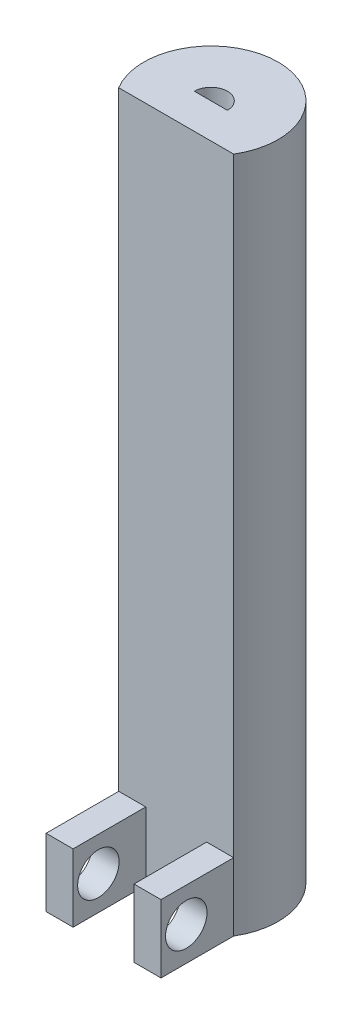
ISO-10303-21;
HEADER;
FILE_DESCRIPTION(('STEP AP214'),'2;1');
FILE_NAME('part.step','',(''),(''),'','','');
FILE_SCHEMA(('AUTOMOTIVE_DESIGN { 1 0 10303 214 1 1 1 1 }'));
ENDSEC;
DATA;
#1=APPLICATION_CONTEXT('core data for automotive mechanical design processes');
#2=APPLICATION_PROTOCOL_DEFINITION('international standard','automotive_design',2000,#1);
#3=PRODUCT_CONTEXT('',#1,'mechanical');
#4=PRODUCT('Part','Part','',(#3));
#5=PRODUCT_RELATED_PRODUCT_CATEGORY('part','',(#4));
#6=PRODUCT_DEFINITION_FORMATION('','',#4);
#7=PRODUCT_DEFINITION_CONTEXT('part definition',#1,'design');
#8=PRODUCT_DEFINITION('design','',#6,#7);
#9=PRODUCT_DEFINITION_SHAPE('','',#8);
#10=(LENGTH_UNIT() NAMED_UNIT(*) SI_UNIT(.MILLI.,.METRE.));
#11=(NAMED_UNIT(*) PLANE_ANGLE_UNIT() SI_UNIT($,.RADIAN.));
#12=(NAMED_UNIT(*) SI_UNIT($,.STERADIAN.) SOLID_ANGLE_UNIT());
#13=UNCERTAINTY_MEASURE_WITH_UNIT(LENGTH_MEASURE(1.E-05),#10,'distance_accuracy_value','');
#14=(GEOMETRIC_REPRESENTATION_CONTEXT(3) GLOBAL_UNCERTAINTY_ASSIGNED_CONTEXT((#13)) GLOBAL_UNIT_ASSIGNED_CONTEXT((#10,
#11,#12)) REPRESENTATION_CONTEXT('',''));
#15=CARTESIAN_POINT('',(0.,0.,0.));
#16=DIRECTION('',(0.,0.,1.));
#17=DIRECTION('',(1.,0.,0.));
#18=AXIS2_PLACEMENT_3D('',#15,#16,#17);
#19=CARTESIAN_POINT('',(10.8004451861737,28.448,6.53795652974117));
#20=DIRECTION('',(0.,0.,-1.));
#21=DIRECTION('',(-1.,0.,0.));
#22=AXIS2_PLACEMENT_3D('',#19,#20,#21);
#23=PLANE('',#22);
#24=DIRECTION('',(0.,-1.,0.));
#25=VECTOR('',#24,1.);
#26=CARTESIAN_POINT('',(5.72044518617372,-114.498809878987,6.53795652974117));
#27=LINE('',#26,#25);
#28=CARTESIAN_POINT('',(5.72044518617372,-114.498809878987,6.53795652974117));
#29=VERTEX_POINT('',#28);
#30=CARTESIAN_POINT('',(5.72044518617372,-127.254,6.53795652974117));
#31=VERTEX_POINT('',#30);
#32=EDGE_CURVE('E48',#29,#31,#27,.T.);
#33=ORIENTED_EDGE('',*,*,#32,.F.);
#34=DIRECTION('',(-1.,0.,0.));
#35=VECTOR('',#34,1.);
#36=CARTESIAN_POINT('',(10.8004451861737,-114.498809878987,6.53795652974117));
#37=LINE('',#36,#35);
#38=CARTESIAN_POINT('',(10.8004451861737,-114.498809878987,6.53795652974117));
#39=VERTEX_POINT('',#38);
#40=EDGE_CURVE('E52',#39,#29,#37,.T.);
#41=ORIENTED_EDGE('',*,*,#40,.F.);
#42=DIRECTION('',(0.,-1.,0.));
#43=VECTOR('',#42,1.);
#44=CARTESIAN_POINT('',(10.8004451861737,28.448,6.53795652974117));
#45=LINE('',#44,#43);
#46=CARTESIAN_POINT('',(10.8004451861737,0.,6.53795652974117));
#47=VERTEX_POINT('',#46);
#48=EDGE_CURVE('E204',#47,#39,#45,.T.);
#49=ORIENTED_EDGE('',*,*,#48,.F.);
#50=DIRECTION('',(-1.,0.,0.));
#51=VECTOR('',#50,1.);
#52=CARTESIAN_POINT('',(0.,0.,6.53795652974117));
#53=LINE('',#52,#51);
#54=CARTESIAN_POINT('',(-10.8004451861737,0.,6.53795652974117));
#55=VERTEX_POINT('',#54);
#56=EDGE_CURVE('E211',#47,#55,#53,.T.);
#57=ORIENTED_EDGE('',*,*,#56,.T.);
#58=DIRECTION('',(0.,-1.,0.));
#59=VECTOR('',#58,1.);
#60=CARTESIAN_POINT('',(-10.8004451861737,28.448,6.53795652974117));
#61=LINE('',#60,#59);
#62=CARTESIAN_POINT('',(-10.8004451861737,-114.498809878987,6.53795652974117));
#63=VERTEX_POINT('',#62);
#64=EDGE_CURVE('E203',#55,#63,#61,.T.);
#65=ORIENTED_EDGE('',*,*,#64,.T.);
#66=DIRECTION('',(1.,0.,0.));
#67=VECTOR('',#66,1.);
#68=CARTESIAN_POINT('',(-10.8004451861737,-114.498809878987,6.53795652974117));
#69=LINE('',#68,#67);
#70=CARTESIAN_POINT('',(-5.72044518617372,-114.498809878987,6.53795652974117));
#71=VERTEX_POINT('',#70);
#72=EDGE_CURVE('E169',#63,#71,#69,.T.);
#73=ORIENTED_EDGE('',*,*,#72,.T.);
#74=DIRECTION('',(0.,-1.,0.));
#75=VECTOR('',#74,1.);
#76=CARTESIAN_POINT('',(-5.72044518617372,-114.498809878987,6.53795652974117));
#77=LINE('',#76,#75);
#78=CARTESIAN_POINT('',(-5.72044518617372,-127.254,6.53795652974117));
#79=VERTEX_POINT('',#78);
#80=EDGE_CURVE('E185',#71,#79,#77,.T.);
#81=ORIENTED_EDGE('',*,*,#80,.T.);
#82=DIRECTION('',(1.,0.,0.));
#83=VECTOR('',#82,1.);
#84=CARTESIAN_POINT('',(10.8004451861737,-127.254,6.53795652974117));
#85=LINE('',#84,#83);
#86=EDGE_CURVE('E199',#79,#31,#85,.T.);
#87=ORIENTED_EDGE('',*,*,#86,.T.);
#88=EDGE_LOOP('',(#33,#41,#49,#57,#65,#73,#81,#87));
#89=FACE_BOUND('',#88,.T.);
#90=ADVANCED_FACE('F33',(#89),#23,.F.);
#91=CARTESIAN_POINT('',(0.,-127.254,0.));
#92=DIRECTION('',(0.,1.,0.));
#93=DIRECTION('',(0.,0.,1.));
#94=AXIS2_PLACEMENT_3D('',#91,#92,#93);
#95=CYLINDRICAL_SURFACE('',#94,12.6251531398367);
#96=ORIENTED_EDGE('',*,*,#48,.T.);
#97=DIRECTION('',(0.,-1.,0.));
#98=VECTOR('',#97,1.);
#99=CARTESIAN_POINT('',(10.8004451861737,-114.498809878987,6.53795652974117));
#100=LINE('',#99,#98);
#101=CARTESIAN_POINT('',(10.8004451861737,-127.254,6.53795652974117));
#102=VERTEX_POINT('',#101);
#103=EDGE_CURVE('E152',#39,#102,#100,.T.);
#104=ORIENTED_EDGE('',*,*,#103,.T.);
#105=CARTESIAN_POINT('',(0.,-127.254,0.));
#106=DIRECTION('',(0.,1.,0.));
#107=DIRECTION('',(0.,0.,1.));
#108=AXIS2_PLACEMENT_3D('',#105,#106,#107);
#109=CIRCLE('',#108,12.6251531398367);
#110=CARTESIAN_POINT('',(-10.8004451861737,-127.254,6.53795652974117));
#111=VERTEX_POINT('',#110);
#112=EDGE_CURVE('E209',#102,#111,#109,.T.);
#113=ORIENTED_EDGE('',*,*,#112,.T.);
#114=DIRECTION('',(0.,-1.,0.));
#115=VECTOR('',#114,1.);
#116=CARTESIAN_POINT('',(-10.8004451861737,-114.498809878987,6.53795652974117));
#117=LINE('',#116,#115);
#118=EDGE_CURVE('E188',#63,#111,#117,.T.);
#119=ORIENTED_EDGE('',*,*,#118,.F.);
#120=ORIENTED_EDGE('',*,*,#64,.F.);
#121=CARTESIAN_POINT('',(0.,0.,0.));
#122=DIRECTION('',(0.,1.,0.));
#123=DIRECTION('',(0.,0.,1.));
#124=AXIS2_PLACEMENT_3D('',#121,#122,#123);
#125=CIRCLE('',#124,12.6251531398367);
#126=EDGE_CURVE('E206',#47,#55,#125,.T.);
#127=ORIENTED_EDGE('',*,*,#126,.F.);
#128=EDGE_LOOP('',(#96,#104,#113,#119,#120,#127));
#129=FACE_BOUND('',#128,.T.);
#130=ADVANCED_FACE('F35',(#129),#95,.T.);
#131=CARTESIAN_POINT('',(0.,-127.254,0.));
#132=DIRECTION('',(0.,1.,0.));
#133=DIRECTION('',(0.,0.,1.));
#134=AXIS2_PLACEMENT_3D('',#131,#132,#133);
#135=PLANE('',#134);
#136=DIRECTION('',(-1.,0.,0.));
#137=VECTOR('',#136,1.);
#138=CARTESIAN_POINT('',(-3.12616908784099,-127.254,0.));
#139=LINE('',#138,#137);
#140=CARTESIAN_POINT('',(3.09162578300214,-127.254,0.));
#141=VERTEX_POINT('',#140);
#142=CARTESIAN_POINT('',(-3.12616908784099,-127.254,0.));
#143=VERTEX_POINT('',#142);
#144=EDGE_CURVE('E193',#141,#143,#139,.T.);
#145=ORIENTED_EDGE('',*,*,#144,.F.);
#146=CARTESIAN_POINT('',(-0.0172716524194207,-127.254,0.));
#147=DIRECTION('',(0.,-1.,0.));
#148=DIRECTION('',(0.,0.,1.));
#149=AXIS2_PLACEMENT_3D('',#146,#147,#148);
#150=CIRCLE('',#149,3.10889743542157);
#151=EDGE_CURVE('E184',#143,#141,#150,.T.);
#152=ORIENTED_EDGE('',*,*,#151,.F.);
#153=EDGE_LOOP('',(#145,#152));
#154=FACE_BOUND('',#153,.T.);
#155=ORIENTED_EDGE('',*,*,#112,.F.);
#156=DIRECTION('',(0.,0.,-1.));
#157=VECTOR('',#156,1.);
#158=CARTESIAN_POINT('',(10.8004451861737,-127.254,20.1914354390968));
#159=LINE('',#158,#157);
#160=CARTESIAN_POINT('',(10.8004451861737,-127.254,20.1914354390968));
#161=VERTEX_POINT('',#160);
#162=EDGE_CURVE('E136',#161,#102,#159,.T.);
#163=ORIENTED_EDGE('',*,*,#162,.F.);
#164=DIRECTION('',(1.,0.,0.));
#165=VECTOR('',#164,1.);
#166=CARTESIAN_POINT('',(5.72044518617372,-127.254,20.1914354390968));
#167=LINE('',#166,#165);
#168=CARTESIAN_POINT('',(5.72044518617372,-127.254,20.1914354390968));
#169=VERTEX_POINT('',#168);
#170=EDGE_CURVE('E146',#169,#161,#167,.T.);
#171=ORIENTED_EDGE('',*,*,#170,.F.);
#172=DIRECTION('',(0.,0.,1.));
#173=VECTOR('',#172,1.);
#174=CARTESIAN_POINT('',(5.72044518617372,-127.254,6.53795652974117));
#175=LINE('',#174,#173);
#176=EDGE_CURVE('E127',#31,#169,#175,.T.);
#177=ORIENTED_EDGE('',*,*,#176,.F.);
#178=ORIENTED_EDGE('',*,*,#86,.F.);
#179=DIRECTION('',(0.,0.,1.));
#180=VECTOR('',#179,1.);
#181=CARTESIAN_POINT('',(-5.72044518617372,-127.254,6.53795652974117));
#182=LINE('',#181,#180);
#183=CARTESIAN_POINT('',(-5.72044518617372,-127.254,20.1914354390968));
#184=VERTEX_POINT('',#183);
#185=EDGE_CURVE('E166',#79,#184,#182,.T.);
#186=ORIENTED_EDGE('',*,*,#185,.T.);
#187=DIRECTION('',(-1.,0.,0.));
#188=VECTOR('',#187,1.);
#189=CARTESIAN_POINT('',(-5.72044518617372,-127.254,20.1914354390968));
#190=LINE('',#189,#188);
#191=CARTESIAN_POINT('',(-10.8004451861737,-127.254,20.1914354390968));
#192=VERTEX_POINT('',#191);
#193=EDGE_CURVE('E159',#184,#192,#190,.T.);
#194=ORIENTED_EDGE('',*,*,#193,.T.);
#195=DIRECTION('',(0.,0.,-1.));
#196=VECTOR('',#195,1.);
#197=CARTESIAN_POINT('',(-10.8004451861737,-127.254,20.1914354390968));
#198=LINE('',#197,#196);
#199=EDGE_CURVE('E177',#192,#111,#198,.T.);
#200=ORIENTED_EDGE('',*,*,#199,.T.);
#201=EDGE_LOOP('',(#155,#163,#171,#177,#178,#186,#194,#200));
#202=FACE_BOUND('',#201,.T.);
#203=ADVANCED_FACE('F227',(#154,#202),#135,.F.);
#204=CARTESIAN_POINT('',(0.,0.,0.));
#205=DIRECTION('',(0.,1.,0.));
#206=DIRECTION('',(0.,0.,1.));
#207=AXIS2_PLACEMENT_3D('',#204,#205,#206);
#208=PLANE('',#207);
#209=CARTESIAN_POINT('',(-0.0172716524194207,0.,0.));
#210=DIRECTION('',(0.,1.,0.));
#211=DIRECTION('',(0.,0.,1.));
#212=AXIS2_PLACEMENT_3D('',#209,#210,#211);
#213=CIRCLE('',#212,3.10889743542157);
#214=CARTESIAN_POINT('',(3.09162578300214,0.,0.));
#215=VERTEX_POINT('',#214);
#216=CARTESIAN_POINT('',(-3.12616908784099,0.,0.));
#217=VERTEX_POINT('',#216);
#218=EDGE_CURVE('E11',#215,#217,#213,.T.);
#219=ORIENTED_EDGE('',*,*,#218,.F.);
#220=DIRECTION('',(1.,0.,0.));
#221=VECTOR('',#220,1.);
#222=CARTESIAN_POINT('',(0.,0.,0.));
#223=LINE('',#222,#221);
#224=EDGE_CURVE('E41',#217,#215,#223,.T.);
#225=ORIENTED_EDGE('',*,*,#224,.F.);
#226=EDGE_LOOP('',(#219,#225));
#227=FACE_BOUND('',#226,.T.);
#228=ORIENTED_EDGE('',*,*,#56,.F.);
#229=ORIENTED_EDGE('',*,*,#126,.T.);
#230=EDGE_LOOP('',(#228,#229));
#231=FACE_BOUND('',#230,.T.);
#232=ADVANCED_FACE('F224',(#227,#231),#208,.T.);
#233=CARTESIAN_POINT('',(-0.0172716524194207,13.827655766843,0.));
#234=DIRECTION('',(0.,-1.,0.));
#235=DIRECTION('',(0.,0.,-1.));
#236=AXIS2_PLACEMENT_3D('',#233,#234,#235);
#237=CYLINDRICAL_SURFACE('',#236,3.10889743542157);
#238=ORIENTED_EDGE('',*,*,#218,.T.);
#239=DIRECTION('',(0.,-1.,0.));
#240=VECTOR('',#239,1.);
#241=CARTESIAN_POINT('',(-3.12616908784099,13.827655766843,0.));
#242=LINE('',#241,#240);
#243=EDGE_CURVE('E197',#217,#143,#242,.T.);
#244=ORIENTED_EDGE('',*,*,#243,.T.);
#245=ORIENTED_EDGE('',*,*,#151,.T.);
#246=DIRECTION('',(0.,-1.,0.));
#247=VECTOR('',#246,1.);
#248=CARTESIAN_POINT('',(3.09162578300214,13.827655766843,0.));
#249=LINE('',#248,#247);
#250=EDGE_CURVE('E196',#215,#141,#249,.T.);
#251=ORIENTED_EDGE('',*,*,#250,.F.);
#252=EDGE_LOOP('',(#238,#244,#245,#251));
#253=FACE_BOUND('',#252,.T.);
#254=ADVANCED_FACE('F222',(#253),#237,.F.);
#255=CARTESIAN_POINT('',(-3.12616908784099,13.827655766843,0.));
#256=DIRECTION('',(0.,0.,1.));
#257=DIRECTION('',(1.,0.,0.));
#258=AXIS2_PLACEMENT_3D('',#255,#256,#257);
#259=PLANE('',#258);
#260=ORIENTED_EDGE('',*,*,#224,.T.);
#261=ORIENTED_EDGE('',*,*,#250,.T.);
#262=ORIENTED_EDGE('',*,*,#144,.T.);
#263=ORIENTED_EDGE('',*,*,#243,.F.);
#264=EDGE_LOOP('',(#260,#261,#262,#263));
#265=FACE_BOUND('',#264,.T.);
#266=ADVANCED_FACE('F217',(#265),#259,.F.);
#267=CARTESIAN_POINT('',(-5.72044518617372,-114.498809878987,20.1914354390968));
#268=DIRECTION('',(0.,0.,1.));
#269=DIRECTION('',(1.,0.,0.));
#270=AXIS2_PLACEMENT_3D('',#267,#268,#269);
#271=PLANE('',#270);
#272=ORIENTED_EDGE('',*,*,#193,.F.);
#273=DIRECTION('',(0.,-1.,0.));
#274=VECTOR('',#273,1.);
#275=CARTESIAN_POINT('',(-5.72044518617372,-114.498809878987,20.1914354390968));
#276=LINE('',#275,#274);
#277=CARTESIAN_POINT('',(-5.72044518617372,-114.498809878987,20.1914354390968));
#278=VERTEX_POINT('',#277);
#279=EDGE_CURVE('E182',#278,#184,#276,.T.);
#280=ORIENTED_EDGE('',*,*,#279,.F.);
#281=DIRECTION('',(-1.,0.,0.));
#282=VECTOR('',#281,1.);
#283=CARTESIAN_POINT('',(-5.72044518617372,-114.498809878987,20.1914354390968));
#284=LINE('',#283,#282);
#285=CARTESIAN_POINT('',(-10.8004451861737,-114.498809878987,20.1914354390968));
#286=VERTEX_POINT('',#285);
#287=EDGE_CURVE('E162',#278,#286,#284,.T.);
#288=ORIENTED_EDGE('',*,*,#287,.T.);
#289=DIRECTION('',(0.,-1.,0.));
#290=VECTOR('',#289,1.);
#291=CARTESIAN_POINT('',(-10.8004451861737,-114.498809878987,20.1914354390968));
#292=LINE('',#291,#290);
#293=EDGE_CURVE('E174',#286,#192,#292,.T.);
#294=ORIENTED_EDGE('',*,*,#293,.T.);
#295=EDGE_LOOP('',(#272,#280,#288,#294));
#296=FACE_BOUND('',#295,.T.);
#297=ADVANCED_FACE('F244',(#296),#271,.T.);
#298=CARTESIAN_POINT('',(-5.72044518617372,-114.498809878987,6.53795652974117));
#299=DIRECTION('',(1.,0.,0.));
#300=DIRECTION('',(0.,0.,-1.));
#301=AXIS2_PLACEMENT_3D('',#298,#299,#300);
#302=PLANE('',#301);
#303=CARTESIAN_POINT('',(-5.72044518617372,-120.904,15.4405772856606));
#304=DIRECTION('',(1.,0.,0.));
#305=DIRECTION('',(0.,0.,-1.));
#306=AXIS2_PLACEMENT_3D('',#303,#304,#305);
#307=CIRCLE('',#306,3.89551607477557);
#308=CARTESIAN_POINT('',(-5.72044518617372,-120.904,11.545061210885));
#309=VERTEX_POINT('',#308);
#310=EDGE_CURVE('E151',#309,#309,#307,.F.);
#311=ORIENTED_EDGE('',*,*,#310,.T.);
#312=EDGE_LOOP('',(#311));
#313=FACE_BOUND('',#312,.T.);
#314=ORIENTED_EDGE('',*,*,#185,.F.);
#315=ORIENTED_EDGE('',*,*,#80,.F.);
#316=DIRECTION('',(0.,0.,1.));
#317=VECTOR('',#316,1.);
#318=CARTESIAN_POINT('',(-5.72044518617372,-114.498809878987,6.53795652974117));
#319=LINE('',#318,#317);
#320=EDGE_CURVE('E171',#71,#278,#319,.T.);
#321=ORIENTED_EDGE('',*,*,#320,.T.);
#322=ORIENTED_EDGE('',*,*,#279,.T.);
#323=EDGE_LOOP('',(#314,#315,#321,#322));
#324=FACE_BOUND('',#323,.T.);
#325=ADVANCED_FACE('F247',(#313,#324),#302,.T.);
#326=CARTESIAN_POINT('',(-10.8004451861737,-114.498809878987,20.1914354390968));
#327=DIRECTION('',(-1.,0.,0.));
#328=DIRECTION('',(0.,0.,1.));
#329=AXIS2_PLACEMENT_3D('',#326,#327,#328);
#330=PLANE('',#329);
#331=CARTESIAN_POINT('',(-10.8004451861737,-120.904,15.4405772856606));
#332=DIRECTION('',(-1.,0.,0.));
#333=DIRECTION('',(0.,0.,1.));
#334=AXIS2_PLACEMENT_3D('',#331,#332,#333);
#335=CIRCLE('',#334,3.89551607477557);
#336=CARTESIAN_POINT('',(-10.8004451861737,-120.904,19.3360933604362));
#337=VERTEX_POINT('',#336);
#338=EDGE_CURVE('E156',#337,#337,#335,.T.);
#339=ORIENTED_EDGE('',*,*,#338,.F.);
#340=EDGE_LOOP('',(#339));
#341=FACE_BOUND('',#340,.T.);
#342=ORIENTED_EDGE('',*,*,#199,.F.);
#343=ORIENTED_EDGE('',*,*,#293,.F.);
#344=DIRECTION('',(0.,0.,-1.));
#345=VECTOR('',#344,1.);
#346=CARTESIAN_POINT('',(-10.8004451861737,-114.498809878987,20.1914354390968));
#347=LINE('',#346,#345);
#348=EDGE_CURVE('E165',#286,#63,#347,.T.);
#349=ORIENTED_EDGE('',*,*,#348,.T.);
#350=ORIENTED_EDGE('',*,*,#118,.T.);
#351=EDGE_LOOP('',(#342,#343,#349,#350));
#352=FACE_BOUND('',#351,.T.);
#353=ADVANCED_FACE('F241',(#341,#352),#330,.T.);
#354=CARTESIAN_POINT('',(0.,-114.498809878987,0.));
#355=DIRECTION('',(0.,-1.,0.));
#356=DIRECTION('',(0.,0.,-1.));
#357=AXIS2_PLACEMENT_3D('',#354,#355,#356);
#358=PLANE('',#357);
#359=ORIENTED_EDGE('',*,*,#287,.F.);
#360=ORIENTED_EDGE('',*,*,#320,.F.);
#361=ORIENTED_EDGE('',*,*,#72,.F.);
#362=ORIENTED_EDGE('',*,*,#348,.F.);
#363=EDGE_LOOP('',(#359,#360,#361,#362));
#364=FACE_BOUND('',#363,.T.);
#365=ADVANCED_FACE('F238',(#364),#358,.F.);
#366=CARTESIAN_POINT('',(12.6261531398367,-120.904,15.4405772856606));
#367=DIRECTION('',(-1.,0.,0.));
#368=DIRECTION('',(0.,0.,1.));
#369=AXIS2_PLACEMENT_3D('',#366,#367,#368);
#370=CYLINDRICAL_SURFACE('',#369,3.89551607477557);
#371=ORIENTED_EDGE('',*,*,#310,.F.);
#372=EDGE_LOOP('',(#371));
#373=FACE_BOUND('',#372,.T.);
#374=ORIENTED_EDGE('',*,*,#338,.T.);
#375=EDGE_LOOP('',(#374));
#376=FACE_BOUND('',#375,.T.);
#377=ADVANCED_FACE('F261',(#373,#376),#370,.F.);
#378=CARTESIAN_POINT('',(5.72044518617372,-114.498809878987,20.1914354390968));
#379=DIRECTION('',(0.,0.,-1.));
#380=DIRECTION('',(-1.,0.,0.));
#381=AXIS2_PLACEMENT_3D('',#378,#379,#380);
#382=PLANE('',#381);
#383=ORIENTED_EDGE('',*,*,#170,.T.);
#384=DIRECTION('',(0.,-1.,0.));
#385=VECTOR('',#384,1.);
#386=CARTESIAN_POINT('',(10.8004451861737,-114.498809878987,20.1914354390968));
#387=LINE('',#386,#385);
#388=CARTESIAN_POINT('',(10.8004451861737,-114.498809878987,20.1914354390968));
#389=VERTEX_POINT('',#388);
#390=EDGE_CURVE('E135',#389,#161,#387,.T.);
#391=ORIENTED_EDGE('',*,*,#390,.F.);
#392=DIRECTION('',(1.,0.,0.));
#393=VECTOR('',#392,1.);
#394=CARTESIAN_POINT('',(5.72044518617372,-114.498809878987,20.1914354390968));
#395=LINE('',#394,#393);
#396=CARTESIAN_POINT('',(5.72044518617372,-114.498809878987,20.1914354390968));
#397=VERTEX_POINT('',#396);
#398=EDGE_CURVE('E119',#397,#389,#395,.T.);
#399=ORIENTED_EDGE('',*,*,#398,.F.);
#400=DIRECTION('',(0.,-1.,0.));
#401=VECTOR('',#400,1.);
#402=CARTESIAN_POINT('',(5.72044518617372,-114.498809878987,20.1914354390968));
#403=LINE('',#402,#401);
#404=EDGE_CURVE('E124',#397,#169,#403,.T.);
#405=ORIENTED_EDGE('',*,*,#404,.T.);
#406=EDGE_LOOP('',(#383,#391,#399,#405));
#407=FACE_BOUND('',#406,.T.);
#408=ADVANCED_FACE('F133',(#407),#382,.F.);
#409=CARTESIAN_POINT('',(10.8004451861737,-114.498809878987,20.1914354390968));
#410=DIRECTION('',(-1.,0.,0.));
#411=DIRECTION('',(0.,0.,1.));
#412=AXIS2_PLACEMENT_3D('',#409,#410,#411);
#413=PLANE('',#412);
#414=CARTESIAN_POINT('',(10.8004451861737,-120.904,15.4405772856606));
#415=DIRECTION('',(-1.,0.,0.));
#416=DIRECTION('',(0.,0.,1.));
#417=AXIS2_PLACEMENT_3D('',#414,#415,#416);
#418=CIRCLE('',#417,3.89551607477557);
#419=CARTESIAN_POINT('',(10.8004451861737,-120.904,19.3360933604362));
#420=VERTEX_POINT('',#419);
#421=EDGE_CURVE('E148',#420,#420,#418,.T.);
#422=ORIENTED_EDGE('',*,*,#421,.T.);
#423=EDGE_LOOP('',(#422));
#424=FACE_BOUND('',#423,.T.);
#425=ORIENTED_EDGE('',*,*,#162,.T.);
#426=ORIENTED_EDGE('',*,*,#103,.F.);
#427=DIRECTION('',(0.,0.,-1.));
#428=VECTOR('',#427,1.);
#429=CARTESIAN_POINT('',(10.8004451861737,-114.498809878987,20.1914354390968));
#430=LINE('',#429,#428);
#431=EDGE_CURVE('E131',#389,#39,#430,.T.);
#432=ORIENTED_EDGE('',*,*,#431,.F.);
#433=ORIENTED_EDGE('',*,*,#390,.T.);
#434=EDGE_LOOP('',(#425,#426,#432,#433));
#435=FACE_BOUND('',#434,.T.);
#436=ADVANCED_FACE('F251',(#424,#435),#413,.F.);
#437=CARTESIAN_POINT('',(5.72044518617372,-114.498809878987,6.53795652974117));
#438=DIRECTION('',(1.,0.,0.));
#439=DIRECTION('',(0.,0.,-1.));
#440=AXIS2_PLACEMENT_3D('',#437,#438,#439);
#441=PLANE('',#440);
#442=CARTESIAN_POINT('',(5.72044518617372,-120.904,15.4405772856606));
#443=DIRECTION('',(1.,0.,0.));
#444=DIRECTION('',(0.,0.,-1.));
#445=AXIS2_PLACEMENT_3D('',#442,#443,#444);
#446=CIRCLE('',#445,3.89551607477557);
#447=CARTESIAN_POINT('',(5.72044518617372,-120.904,11.545061210885));
#448=VERTEX_POINT('',#447);
#449=EDGE_CURVE('E141',#448,#448,#446,.T.);
#450=ORIENTED_EDGE('',*,*,#449,.T.);
#451=EDGE_LOOP('',(#450));
#452=FACE_BOUND('',#451,.T.);
#453=ORIENTED_EDGE('',*,*,#176,.T.);
#454=ORIENTED_EDGE('',*,*,#404,.F.);
#455=DIRECTION('',(0.,0.,1.));
#456=VECTOR('',#455,1.);
#457=CARTESIAN_POINT('',(5.72044518617372,-114.498809878987,6.53795652974117));
#458=LINE('',#457,#456);
#459=EDGE_CURVE('E114',#29,#397,#458,.T.);
#460=ORIENTED_EDGE('',*,*,#459,.F.);
#461=ORIENTED_EDGE('',*,*,#32,.T.);
#462=EDGE_LOOP('',(#453,#454,#460,#461));
#463=FACE_BOUND('',#462,.T.);
#464=ADVANCED_FACE('F125',(#452,#463),#441,.F.);
#465=CARTESIAN_POINT('',(0.,-114.498809878987,0.));
#466=DIRECTION('',(0.,-1.,0.));
#467=DIRECTION('',(0.,0.,-1.));
#468=AXIS2_PLACEMENT_3D('',#465,#466,#467);
#469=PLANE('',#468);
#470=ORIENTED_EDGE('',*,*,#398,.T.);
#471=ORIENTED_EDGE('',*,*,#431,.T.);
#472=ORIENTED_EDGE('',*,*,#40,.T.);
#473=ORIENTED_EDGE('',*,*,#459,.T.);
#474=EDGE_LOOP('',(#470,#471,#472,#473));
#475=FACE_BOUND('',#474,.T.);
#476=ADVANCED_FACE('F116',(#475),#469,.F.);
#477=CARTESIAN_POINT('',(-12.6261531398367,-120.904,15.4405772856606));
#478=DIRECTION('',(1.,0.,0.));
#479=DIRECTION('',(0.,0.,-1.));
#480=AXIS2_PLACEMENT_3D('',#477,#478,#479);
#481=CYLINDRICAL_SURFACE('',#480,3.89551607477557);
#482=ORIENTED_EDGE('',*,*,#421,.F.);
#483=EDGE_LOOP('',(#482));
#484=FACE_BOUND('',#483,.T.);
#485=ORIENTED_EDGE('',*,*,#449,.F.);
#486=EDGE_LOOP('',(#485));
#487=FACE_BOUND('',#486,.T.);
#488=ADVANCED_FACE('F349',(#484,#487),#481,.F.);
#489=CLOSED_SHELL('',(#90,#130,#203,#232,#254,#266,#297,#325,#353,#365,#377,#408,#436,#464,#476,#488));
#490=MANIFOLD_SOLID_BREP('B2',#489);
#491=ADVANCED_BREP_SHAPE_REPRESENTATION('',(#18,#490),#14);
#492=SHAPE_DEFINITION_REPRESENTATION(#9,#491);
ENDSEC;
END-ISO-10303-21;
